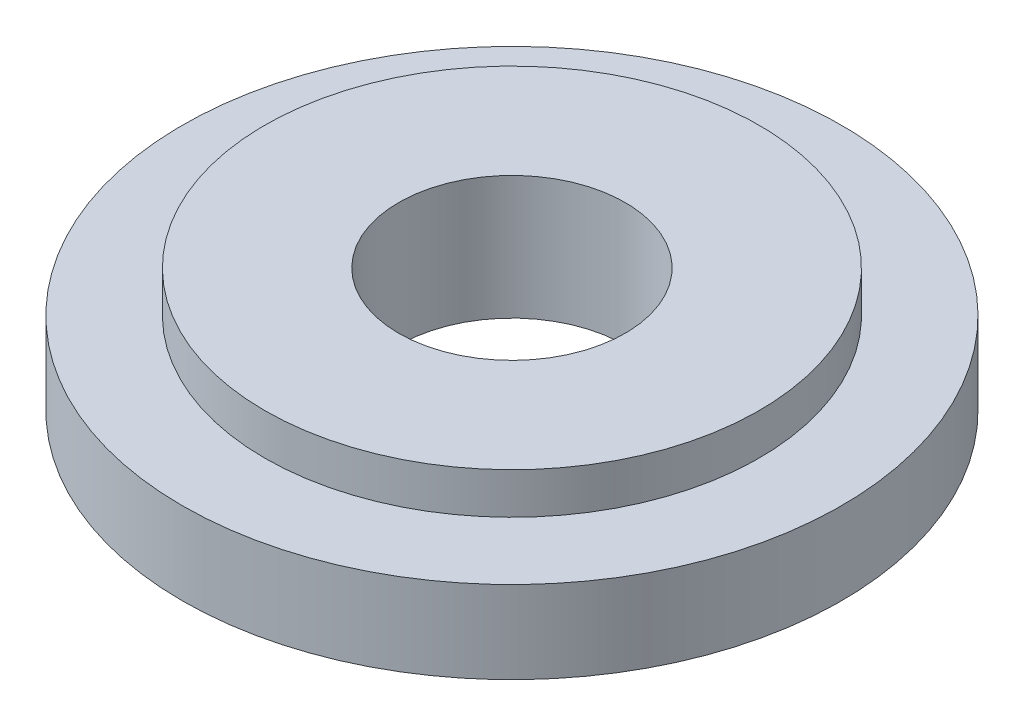
ISO-10303-21;
HEADER;
FILE_DESCRIPTION(('STEP AP214'),'2;1');
FILE_NAME('part.step','',(''),(''),'','','');
FILE_SCHEMA(('AUTOMOTIVE_DESIGN { 1 0 10303 214 1 1 1 1 }'));
ENDSEC;
DATA;
#1=APPLICATION_CONTEXT('core data for automotive mechanical design processes');
#2=APPLICATION_PROTOCOL_DEFINITION('international standard','automotive_design',2000,#1);
#3=PRODUCT_CONTEXT('',#1,'mechanical');
#4=PRODUCT('Part','Part','',(#3));
#5=PRODUCT_RELATED_PRODUCT_CATEGORY('part','',(#4));
#6=PRODUCT_DEFINITION_FORMATION('','',#4);
#7=PRODUCT_DEFINITION_CONTEXT('part definition',#1,'design');
#8=PRODUCT_DEFINITION('design','',#6,#7);
#9=PRODUCT_DEFINITION_SHAPE('','',#8);
#10=(LENGTH_UNIT() NAMED_UNIT(*) SI_UNIT(.MILLI.,.METRE.));
#11=(NAMED_UNIT(*) PLANE_ANGLE_UNIT() SI_UNIT($,.RADIAN.));
#12=(NAMED_UNIT(*) SI_UNIT($,.STERADIAN.) SOLID_ANGLE_UNIT());
#13=UNCERTAINTY_MEASURE_WITH_UNIT(LENGTH_MEASURE(1.E-05),#10,'distance_accuracy_value','');
#14=(GEOMETRIC_REPRESENTATION_CONTEXT(3) GLOBAL_UNCERTAINTY_ASSIGNED_CONTEXT((#13)) GLOBAL_UNIT_ASSIGNED_CONTEXT((#10,
#11,#12)) REPRESENTATION_CONTEXT('',''));
#15=CARTESIAN_POINT('',(0.,0.,0.));
#16=DIRECTION('',(0.,0.,1.));
#17=DIRECTION('',(1.,0.,0.));
#18=AXIS2_PLACEMENT_3D('',#15,#16,#17);
#19=CARTESIAN_POINT('',(0.,2.,0.));
#20=DIRECTION('',(0.,1.,0.));
#21=DIRECTION('',(0.,0.,1.));
#22=AXIS2_PLACEMENT_3D('',#19,#20,#21);
#23=PLANE('',#22);
#24=CARTESIAN_POINT('',(0.,2.,0.));
#25=DIRECTION('',(0.,1.,0.));
#26=DIRECTION('',(0.,0.,1.));
#27=AXIS2_PLACEMENT_3D('',#24,#25,#26);
#28=CIRCLE('',#27,8.);
#29=CARTESIAN_POINT('',(0.,2.,8.));
#30=VERTEX_POINT('',#29);
#31=EDGE_CURVE('E10',#30,#30,#28,.T.);
#32=ORIENTED_EDGE('',*,*,#31,.T.);
#33=EDGE_LOOP('',(#32));
#34=FACE_BOUND('',#33,.T.);
#35=CARTESIAN_POINT('',(0.,2.,0.));
#36=DIRECTION('',(0.,1.,0.));
#37=DIRECTION('',(0.,0.,1.));
#38=AXIS2_PLACEMENT_3D('',#35,#36,#37);
#39=CIRCLE('',#38,6.);
#40=CARTESIAN_POINT('',(0.,2.,6.));
#41=VERTEX_POINT('',#40);
#42=EDGE_CURVE('E41',#41,#41,#39,.F.);
#43=ORIENTED_EDGE('',*,*,#42,.T.);
#44=EDGE_LOOP('',(#43));
#45=FACE_BOUND('',#44,.T.);
#46=ADVANCED_FACE('F37',(#34,#45),#23,.T.);
#47=CARTESIAN_POINT('',(0.,0.,0.));
#48=DIRECTION('',(0.,1.,0.));
#49=DIRECTION('',(0.,0.,1.));
#50=AXIS2_PLACEMENT_3D('',#47,#48,#49);
#51=PLANE('',#50);
#52=CARTESIAN_POINT('',(0.,0.,0.));
#53=DIRECTION('',(0.,1.,0.));
#54=DIRECTION('',(0.,0.,1.));
#55=AXIS2_PLACEMENT_3D('',#52,#53,#54);
#56=CIRCLE('',#55,8.);
#57=CARTESIAN_POINT('',(0.,0.,8.));
#58=VERTEX_POINT('',#57);
#59=EDGE_CURVE('E46',#58,#58,#56,.T.);
#60=ORIENTED_EDGE('',*,*,#59,.F.);
#61=EDGE_LOOP('',(#60));
#62=FACE_BOUND('',#61,.T.);
#63=CARTESIAN_POINT('',(0.,0.,0.));
#64=DIRECTION('',(0.,1.,0.));
#65=DIRECTION('',(0.,0.,1.));
#66=AXIS2_PLACEMENT_3D('',#63,#64,#65);
#67=CIRCLE('',#66,2.75);
#68=CARTESIAN_POINT('',(0.,0.,2.75));
#69=VERTEX_POINT('',#68);
#70=EDGE_CURVE('E52',#69,#69,#67,.T.);
#71=ORIENTED_EDGE('',*,*,#70,.T.);
#72=EDGE_LOOP('',(#71));
#73=FACE_BOUND('',#72,.T.);
#74=ADVANCED_FACE('F82',(#62,#73),#51,.F.);
#75=CARTESIAN_POINT('',(0.,2.,0.));
#76=DIRECTION('',(0.,-1.,0.));
#77=DIRECTION('',(0.,0.,-1.));
#78=AXIS2_PLACEMENT_3D('',#75,#76,#77);
#79=CYLINDRICAL_SURFACE('',#78,8.);
#80=ORIENTED_EDGE('',*,*,#31,.F.);
#81=EDGE_LOOP('',(#80));
#82=FACE_BOUND('',#81,.T.);
#83=ORIENTED_EDGE('',*,*,#59,.T.);
#84=EDGE_LOOP('',(#83));
#85=FACE_BOUND('',#84,.T.);
#86=ADVANCED_FACE('F39',(#82,#85),#79,.T.);
#87=CARTESIAN_POINT('',(0.,2.,0.));
#88=DIRECTION('',(0.,-1.,0.));
#89=DIRECTION('',(0.,0.,-1.));
#90=AXIS2_PLACEMENT_3D('',#87,#88,#89);
#91=CYLINDRICAL_SURFACE('',#90,2.75);
#92=ORIENTED_EDGE('',*,*,#70,.F.);
#93=EDGE_LOOP('',(#92));
#94=FACE_BOUND('',#93,.T.);
#95=CARTESIAN_POINT('',(0.,3.,0.));
#96=DIRECTION('',(0.,1.,0.));
#97=DIRECTION('',(0.,0.,1.));
#98=AXIS2_PLACEMENT_3D('',#95,#96,#97);
#99=CIRCLE('',#98,2.75);
#100=CARTESIAN_POINT('',(0.,3.,2.75));
#101=VERTEX_POINT('',#100);
#102=EDGE_CURVE('E61',#101,#101,#99,.T.);
#103=ORIENTED_EDGE('',*,*,#102,.T.);
#104=EDGE_LOOP('',(#103));
#105=FACE_BOUND('',#104,.T.);
#106=ADVANCED_FACE('F66',(#94,#105),#91,.F.);
#107=CARTESIAN_POINT('',(0.,3.,0.));
#108=DIRECTION('',(0.,1.,0.));
#109=DIRECTION('',(0.,0.,1.));
#110=AXIS2_PLACEMENT_3D('',#107,#108,#109);
#111=PLANE('',#110);
#112=CARTESIAN_POINT('',(0.,3.,0.));
#113=DIRECTION('',(0.,1.,0.));
#114=DIRECTION('',(0.,0.,1.));
#115=AXIS2_PLACEMENT_3D('',#112,#113,#114);
#116=CIRCLE('',#115,6.);
#117=CARTESIAN_POINT('',(0.,3.,6.));
#118=VERTEX_POINT('',#117);
#119=EDGE_CURVE('E57',#118,#118,#116,.T.);
#120=ORIENTED_EDGE('',*,*,#119,.T.);
#121=EDGE_LOOP('',(#120));
#122=FACE_BOUND('',#121,.T.);
#123=ORIENTED_EDGE('',*,*,#102,.F.);
#124=EDGE_LOOP('',(#123));
#125=FACE_BOUND('',#124,.T.);
#126=ADVANCED_FACE('F68',(#122,#125),#111,.T.);
#127=CARTESIAN_POINT('',(0.,3.,0.));
#128=DIRECTION('',(0.,-1.,0.));
#129=DIRECTION('',(0.,0.,-1.));
#130=AXIS2_PLACEMENT_3D('',#127,#128,#129);
#131=CYLINDRICAL_SURFACE('',#130,6.);
#132=ORIENTED_EDGE('',*,*,#42,.F.);
#133=EDGE_LOOP('',(#132));
#134=FACE_BOUND('',#133,.T.);
#135=ORIENTED_EDGE('',*,*,#119,.F.);
#136=EDGE_LOOP('',(#135));
#137=FACE_BOUND('',#136,.T.);
#138=ADVANCED_FACE('F70',(#134,#137),#131,.T.);
#139=CLOSED_SHELL('',(#46,#74,#86,#106,#126,#138));
#140=MANIFOLD_SOLID_BREP('B2',#139);
#141=ADVANCED_BREP_SHAPE_REPRESENTATION('',(#18,#140),#14);
#142=SHAPE_DEFINITION_REPRESENTATION(#9,#141);
ENDSEC;
END-ISO-10303-21;
